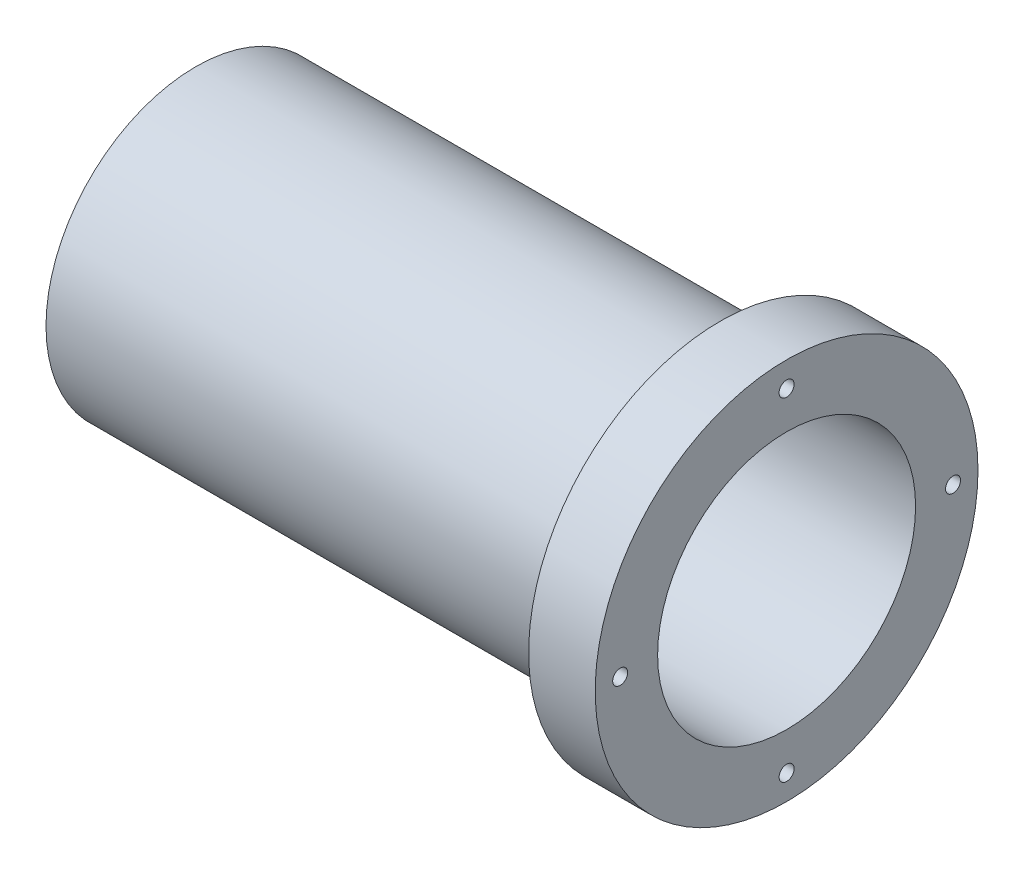
ISO-10303-21;
HEADER;
FILE_DESCRIPTION(('STEP AP214'),'2;1');
FILE_NAME('part.step','',(''),(''),'','','');
FILE_SCHEMA(('AUTOMOTIVE_DESIGN { 1 0 10303 214 1 1 1 1 }'));
ENDSEC;
DATA;
#1=APPLICATION_CONTEXT('core data for automotive mechanical design processes');
#2=APPLICATION_PROTOCOL_DEFINITION('international standard','automotive_design',2000,#1);
#3=PRODUCT_CONTEXT('',#1,'mechanical');
#4=PRODUCT('Part','Part','',(#3));
#5=PRODUCT_RELATED_PRODUCT_CATEGORY('part','',(#4));
#6=PRODUCT_DEFINITION_FORMATION('','',#4);
#7=PRODUCT_DEFINITION_CONTEXT('part definition',#1,'design');
#8=PRODUCT_DEFINITION('design','',#6,#7);
#9=PRODUCT_DEFINITION_SHAPE('','',#8);
#10=(LENGTH_UNIT() NAMED_UNIT(*) SI_UNIT(.MILLI.,.METRE.));
#11=(NAMED_UNIT(*) PLANE_ANGLE_UNIT() SI_UNIT($,.RADIAN.));
#12=(NAMED_UNIT(*) SI_UNIT($,.STERADIAN.) SOLID_ANGLE_UNIT());
#13=UNCERTAINTY_MEASURE_WITH_UNIT(LENGTH_MEASURE(1.E-05),#10,'distance_accuracy_value','');
#14=(GEOMETRIC_REPRESENTATION_CONTEXT(3) GLOBAL_UNCERTAINTY_ASSIGNED_CONTEXT((#13)) GLOBAL_UNIT_ASSIGNED_CONTEXT((#10,
#11,#12)) REPRESENTATION_CONTEXT('',''));
#15=CARTESIAN_POINT('',(0.,0.,0.));
#16=DIRECTION('',(0.,0.,1.));
#17=DIRECTION('',(1.,0.,0.));
#18=AXIS2_PLACEMENT_3D('',#15,#16,#17);
#19=CARTESIAN_POINT('',(121.,0.,0.));
#20=DIRECTION('',(-1.,0.,0.));
#21=DIRECTION('',(0.,0.,1.));
#22=AXIS2_PLACEMENT_3D('',#19,#20,#21);
#23=CYLINDRICAL_SURFACE('',#22,36.);
#24=CARTESIAN_POINT('',(121.,0.,0.));
#25=DIRECTION('',(1.,0.,0.));
#26=DIRECTION('',(0.,0.,-1.));
#27=AXIS2_PLACEMENT_3D('',#24,#25,#26);
#28=CIRCLE('',#27,36.);
#29=CARTESIAN_POINT('',(121.,0.,-36.));
#30=VERTEX_POINT('',#29);
#31=EDGE_CURVE('E10',#30,#30,#28,.T.);
#32=ORIENTED_EDGE('',*,*,#31,.F.);
#33=EDGE_LOOP('',(#32));
#34=FACE_BOUND('',#33,.T.);
#35=CARTESIAN_POINT('',(-5.,0.,0.));
#36=DIRECTION('',(-1.,0.,0.));
#37=DIRECTION('',(0.,0.,1.));
#38=AXIS2_PLACEMENT_3D('',#35,#36,#37);
#39=CIRCLE('',#38,36.);
#40=CARTESIAN_POINT('',(-5.,0.,36.));
#41=VERTEX_POINT('',#40);
#42=EDGE_CURVE('E73',#41,#41,#39,.T.);
#43=ORIENTED_EDGE('',*,*,#42,.F.);
#44=EDGE_LOOP('',(#43));
#45=FACE_BOUND('',#44,.T.);
#46=ADVANCED_FACE('F37',(#34,#45),#23,.T.);
#47=CARTESIAN_POINT('',(121.,0.,0.));
#48=DIRECTION('',(-1.,0.,0.));
#49=DIRECTION('',(0.,0.,1.));
#50=AXIS2_PLACEMENT_3D('',#47,#48,#49);
#51=CYLINDRICAL_SURFACE('',#50,31.);
#52=CARTESIAN_POINT('',(0.,0.,0.));
#53=DIRECTION('',(1.,0.,0.));
#54=DIRECTION('',(0.,0.,-1.));
#55=AXIS2_PLACEMENT_3D('',#52,#53,#54);
#56=CIRCLE('',#55,31.);
#57=CARTESIAN_POINT('',(0.,0.,-31.));
#58=VERTEX_POINT('',#57);
#59=EDGE_CURVE('E44',#58,#58,#56,.T.);
#60=ORIENTED_EDGE('',*,*,#59,.F.);
#61=EDGE_LOOP('',(#60));
#62=FACE_BOUND('',#61,.T.);
#63=CARTESIAN_POINT('',(137.,0.,0.));
#64=DIRECTION('',(1.,0.,0.));
#65=DIRECTION('',(0.,0.,-1.));
#66=AXIS2_PLACEMENT_3D('',#63,#64,#65);
#67=CIRCLE('',#66,31.);
#68=CARTESIAN_POINT('',(137.,0.,-31.));
#69=VERTEX_POINT('',#68);
#70=EDGE_CURVE('E85',#69,#69,#67,.T.);
#71=ORIENTED_EDGE('',*,*,#70,.T.);
#72=EDGE_LOOP('',(#71));
#73=FACE_BOUND('',#72,.T.);
#74=ADVANCED_FACE('F106',(#62,#73),#51,.F.);
#75=CARTESIAN_POINT('',(137.,0.,0.));
#76=DIRECTION('',(1.,0.,0.));
#77=DIRECTION('',(0.,0.,-1.));
#78=AXIS2_PLACEMENT_3D('',#75,#76,#77);
#79=PLANE('',#78);
#80=CARTESIAN_POINT('',(137.,40.,0.));
#81=DIRECTION('',(1.,0.,0.));
#82=DIRECTION('',(0.,0.,-1.));
#83=AXIS2_PLACEMENT_3D('',#80,#81,#82);
#84=CIRCLE('',#83,1.80000000000249);
#85=CARTESIAN_POINT('',(137.,40.,-1.80000000000249));
#86=VERTEX_POINT('',#85);
#87=EDGE_CURVE('E57',#86,#86,#84,.T.);
#88=ORIENTED_EDGE('',*,*,#87,.F.);
#89=EDGE_LOOP('',(#88));
#90=FACE_BOUND('',#89,.T.);
#91=CARTESIAN_POINT('',(137.,1.15690195501756E-12,-40.0000000000012));
#92=DIRECTION('',(1.,0.,0.));
#93=DIRECTION('',(0.,0.,-1.));
#94=AXIS2_PLACEMENT_3D('',#91,#92,#93);
#95=CIRCLE('',#94,1.80000000000249);
#96=CARTESIAN_POINT('',(137.,1.15690195501756E-12,-41.8000000000036));
#97=VERTEX_POINT('',#96);
#98=EDGE_CURVE('E269',#97,#97,#95,.T.);
#99=ORIENTED_EDGE('',*,*,#98,.F.);
#100=EDGE_LOOP('',(#99));
#101=FACE_BOUND('',#100,.T.);
#102=CARTESIAN_POINT('',(137.,-40.,-2.31489411623018E-12));
#103=DIRECTION('',(1.,0.,0.));
#104=DIRECTION('',(0.,0.,-1.));
#105=AXIS2_PLACEMENT_3D('',#102,#103,#104);
#106=CIRCLE('',#105,1.80000000000249);
#107=CARTESIAN_POINT('',(137.,-40.,-1.8000000000048));
#108=VERTEX_POINT('',#107);
#109=EDGE_CURVE('E272',#108,#108,#106,.T.);
#110=ORIENTED_EDGE('',*,*,#109,.F.);
#111=EDGE_LOOP('',(#110));
#112=FACE_BOUND('',#111,.T.);
#113=CARTESIAN_POINT('',(137.,-1.16180054221415E-12,39.9999999999988));
#114=DIRECTION('',(1.,0.,0.));
#115=DIRECTION('',(0.,0.,-1.));
#116=AXIS2_PLACEMENT_3D('',#113,#114,#115);
#117=CIRCLE('',#116,1.80000000000249);
#118=CARTESIAN_POINT('',(137.,-1.16180054221415E-12,38.1999999999964));
#119=VERTEX_POINT('',#118);
#120=EDGE_CURVE('E276',#119,#119,#117,.T.);
#121=ORIENTED_EDGE('',*,*,#120,.F.);
#122=EDGE_LOOP('',(#121));
#123=FACE_BOUND('',#122,.T.);
#124=CARTESIAN_POINT('',(137.,0.,0.));
#125=DIRECTION('',(1.,0.,0.));
#126=DIRECTION('',(0.,0.,-1.));
#127=AXIS2_PLACEMENT_3D('',#124,#125,#126);
#128=CIRCLE('',#127,46.);
#129=CARTESIAN_POINT('',(137.,0.,-46.));
#130=VERTEX_POINT('',#129);
#131=EDGE_CURVE('E49',#130,#130,#128,.T.);
#132=ORIENTED_EDGE('',*,*,#131,.T.);
#133=EDGE_LOOP('',(#132));
#134=FACE_BOUND('',#133,.T.);
#135=ORIENTED_EDGE('',*,*,#70,.F.);
#136=EDGE_LOOP('',(#135));
#137=FACE_BOUND('',#136,.T.);
#138=ADVANCED_FACE('F97',(#90,#101,#112,#123,#134,#137),#79,.T.);
#139=CARTESIAN_POINT('',(121.,0.,0.));
#140=DIRECTION('',(1.,0.,0.));
#141=DIRECTION('',(0.,0.,-1.));
#142=AXIS2_PLACEMENT_3D('',#139,#140,#141);
#143=PLANE('',#142);
#144=CARTESIAN_POINT('',(121.,40.,0.));
#145=DIRECTION('',(1.,0.,0.));
#146=DIRECTION('',(0.,0.,-1.));
#147=AXIS2_PLACEMENT_3D('',#144,#145,#146);
#148=CIRCLE('',#147,1.80000000000249);
#149=CARTESIAN_POINT('',(121.,40.,-1.80000000000249));
#150=VERTEX_POINT('',#149);
#151=EDGE_CURVE('E40',#150,#150,#148,.T.);
#152=ORIENTED_EDGE('',*,*,#151,.T.);
#153=EDGE_LOOP('',(#152));
#154=FACE_BOUND('',#153,.T.);
#155=CARTESIAN_POINT('',(121.,1.15690195501756E-12,-40.0000000000012));
#156=DIRECTION('',(1.,0.,0.));
#157=DIRECTION('',(0.,0.,-1.));
#158=AXIS2_PLACEMENT_3D('',#155,#156,#157);
#159=CIRCLE('',#158,1.80000000000249);
#160=CARTESIAN_POINT('',(121.,1.15690195501756E-12,-41.8000000000036));
#161=VERTEX_POINT('',#160);
#162=EDGE_CURVE('E59',#161,#161,#159,.T.);
#163=ORIENTED_EDGE('',*,*,#162,.T.);
#164=EDGE_LOOP('',(#163));
#165=FACE_BOUND('',#164,.T.);
#166=CARTESIAN_POINT('',(121.,-40.,-2.31489411623018E-12));
#167=DIRECTION('',(1.,0.,0.));
#168=DIRECTION('',(0.,0.,-1.));
#169=AXIS2_PLACEMENT_3D('',#166,#167,#168);
#170=CIRCLE('',#169,1.80000000000249);
#171=CARTESIAN_POINT('',(121.,-40.,-1.8000000000048));
#172=VERTEX_POINT('',#171);
#173=EDGE_CURVE('E56',#172,#172,#170,.T.);
#174=ORIENTED_EDGE('',*,*,#173,.T.);
#175=EDGE_LOOP('',(#174));
#176=FACE_BOUND('',#175,.T.);
#177=CARTESIAN_POINT('',(121.,-1.16180054221415E-12,39.9999999999988));
#178=DIRECTION('',(1.,0.,0.));
#179=DIRECTION('',(0.,0.,-1.));
#180=AXIS2_PLACEMENT_3D('',#177,#178,#179);
#181=CIRCLE('',#180,1.80000000000249);
#182=CARTESIAN_POINT('',(121.,-1.16180054221415E-12,38.1999999999964));
#183=VERTEX_POINT('',#182);
#184=EDGE_CURVE('E53',#183,#183,#181,.T.);
#185=ORIENTED_EDGE('',*,*,#184,.T.);
#186=EDGE_LOOP('',(#185));
#187=FACE_BOUND('',#186,.T.);
#188=ORIENTED_EDGE('',*,*,#31,.T.);
#189=EDGE_LOOP('',(#188));
#190=FACE_BOUND('',#189,.T.);
#191=CARTESIAN_POINT('',(121.,0.,0.));
#192=DIRECTION('',(1.,0.,0.));
#193=DIRECTION('',(0.,0.,-1.));
#194=AXIS2_PLACEMENT_3D('',#191,#192,#193);
#195=CIRCLE('',#194,46.);
#196=CARTESIAN_POINT('',(121.,0.,-46.));
#197=VERTEX_POINT('',#196);
#198=EDGE_CURVE('E88',#197,#197,#195,.T.);
#199=ORIENTED_EDGE('',*,*,#198,.F.);
#200=EDGE_LOOP('',(#199));
#201=FACE_BOUND('',#200,.T.);
#202=ADVANCED_FACE('F95',(#154,#165,#176,#187,#190,#201),#143,.F.);
#203=CARTESIAN_POINT('',(137.,0.,0.));
#204=DIRECTION('',(-1.,0.,0.));
#205=DIRECTION('',(0.,0.,1.));
#206=AXIS2_PLACEMENT_3D('',#203,#204,#205);
#207=CYLINDRICAL_SURFACE('',#206,46.);
#208=ORIENTED_EDGE('',*,*,#131,.F.);
#209=EDGE_LOOP('',(#208));
#210=FACE_BOUND('',#209,.T.);
#211=ORIENTED_EDGE('',*,*,#198,.T.);
#212=EDGE_LOOP('',(#211));
#213=FACE_BOUND('',#212,.T.);
#214=ADVANCED_FACE('F93',(#210,#213),#207,.T.);
#215=CARTESIAN_POINT('',(0.,0.,0.));
#216=DIRECTION('',(-1.,0.,0.));
#217=DIRECTION('',(0.,0.,1.));
#218=AXIS2_PLACEMENT_3D('',#215,#216,#217);
#219=PLANE('',#218);
#220=CARTESIAN_POINT('',(0.,0.,0.));
#221=DIRECTION('',(-1.,0.,0.));
#222=DIRECTION('',(0.,0.,1.));
#223=AXIS2_PLACEMENT_3D('',#220,#221,#222);
#224=CIRCLE('',#223,28.5);
#225=CARTESIAN_POINT('',(0.,0.,28.5));
#226=VERTEX_POINT('',#225);
#227=EDGE_CURVE('E82',#226,#226,#224,.T.);
#228=ORIENTED_EDGE('',*,*,#227,.T.);
#229=EDGE_LOOP('',(#228));
#230=FACE_BOUND('',#229,.T.);
#231=ORIENTED_EDGE('',*,*,#59,.T.);
#232=EDGE_LOOP('',(#231));
#233=FACE_BOUND('',#232,.T.);
#234=ADVANCED_FACE('F103',(#230,#233),#219,.F.);
#235=CARTESIAN_POINT('',(-2.,0.,0.));
#236=DIRECTION('',(1.,0.,0.));
#237=DIRECTION('',(0.,0.,-1.));
#238=AXIS2_PLACEMENT_3D('',#235,#236,#237);
#239=CYLINDRICAL_SURFACE('',#238,28.5);
#240=CARTESIAN_POINT('',(-2.,0.,0.));
#241=DIRECTION('',(-1.,0.,0.));
#242=DIRECTION('',(0.,0.,1.));
#243=AXIS2_PLACEMENT_3D('',#240,#241,#242);
#244=CIRCLE('',#243,28.5);
#245=CARTESIAN_POINT('',(-2.,0.,28.5));
#246=VERTEX_POINT('',#245);
#247=EDGE_CURVE('E79',#246,#246,#244,.T.);
#248=ORIENTED_EDGE('',*,*,#247,.T.);
#249=EDGE_LOOP('',(#248));
#250=FACE_BOUND('',#249,.T.);
#251=ORIENTED_EDGE('',*,*,#227,.F.);
#252=EDGE_LOOP('',(#251));
#253=FACE_BOUND('',#252,.T.);
#254=ADVANCED_FACE('F140',(#250,#253),#239,.F.);
#255=CARTESIAN_POINT('',(-2.,0.,0.));
#256=DIRECTION('',(-1.,0.,0.));
#257=DIRECTION('',(0.,0.,1.));
#258=AXIS2_PLACEMENT_3D('',#255,#256,#257);
#259=PLANE('',#258);
#260=CARTESIAN_POINT('',(-2.,0.,0.));
#261=DIRECTION('',(-1.,0.,0.));
#262=DIRECTION('',(0.,0.,1.));
#263=AXIS2_PLACEMENT_3D('',#260,#261,#262);
#264=CIRCLE('',#263,17.);
#265=CARTESIAN_POINT('',(-2.,0.,17.));
#266=VERTEX_POINT('',#265);
#267=EDGE_CURVE('E64',#266,#266,#264,.T.);
#268=ORIENTED_EDGE('',*,*,#267,.T.);
#269=EDGE_LOOP('',(#268));
#270=FACE_BOUND('',#269,.T.);
#271=ORIENTED_EDGE('',*,*,#247,.F.);
#272=EDGE_LOOP('',(#271));
#273=FACE_BOUND('',#272,.T.);
#274=ADVANCED_FACE('F122',(#270,#273),#259,.F.);
#275=CARTESIAN_POINT('',(-5.,0.,0.));
#276=DIRECTION('',(-1.,0.,0.));
#277=DIRECTION('',(0.,0.,1.));
#278=AXIS2_PLACEMENT_3D('',#275,#276,#277);
#279=PLANE('',#278);
#280=ORIENTED_EDGE('',*,*,#42,.T.);
#281=EDGE_LOOP('',(#280));
#282=FACE_BOUND('',#281,.T.);
#283=CARTESIAN_POINT('',(-5.,0.,0.));
#284=DIRECTION('',(-1.,0.,0.));
#285=DIRECTION('',(0.,0.,1.));
#286=AXIS2_PLACEMENT_3D('',#283,#284,#285);
#287=CIRCLE('',#286,17.);
#288=CARTESIAN_POINT('',(-5.,0.,17.));
#289=VERTEX_POINT('',#288);
#290=EDGE_CURVE('E68',#289,#289,#287,.T.);
#291=ORIENTED_EDGE('',*,*,#290,.F.);
#292=EDGE_LOOP('',(#291));
#293=FACE_BOUND('',#292,.T.);
#294=ADVANCED_FACE('F118',(#282,#293),#279,.T.);
#295=CARTESIAN_POINT('',(-5.,0.,0.));
#296=DIRECTION('',(1.,0.,0.));
#297=DIRECTION('',(0.,0.,-1.));
#298=AXIS2_PLACEMENT_3D('',#295,#296,#297);
#299=CYLINDRICAL_SURFACE('',#298,17.);
#300=ORIENTED_EDGE('',*,*,#290,.T.);
#301=EDGE_LOOP('',(#300));
#302=FACE_BOUND('',#301,.T.);
#303=ORIENTED_EDGE('',*,*,#267,.F.);
#304=EDGE_LOOP('',(#303));
#305=FACE_BOUND('',#304,.T.);
#306=ADVANCED_FACE('F121',(#302,#305),#299,.F.);
#307=CARTESIAN_POINT('',(117.,-1.16180054221415E-12,39.9999999999988));
#308=DIRECTION('',(1.,0.,0.));
#309=DIRECTION('',(0.,0.,-1.));
#310=AXIS2_PLACEMENT_3D('',#307,#308,#309);
#311=CYLINDRICAL_SURFACE('',#310,1.80000000000249);
#312=ORIENTED_EDGE('',*,*,#120,.T.);
#313=EDGE_LOOP('',(#312));
#314=FACE_BOUND('',#313,.T.);
#315=ORIENTED_EDGE('',*,*,#184,.F.);
#316=EDGE_LOOP('',(#315));
#317=FACE_BOUND('',#316,.T.);
#318=ADVANCED_FACE('F128',(#314,#317),#311,.F.);
#319=CARTESIAN_POINT('',(117.,-40.,-2.31489411623018E-12));
#320=DIRECTION('',(1.,0.,0.));
#321=DIRECTION('',(0.,0.,-1.));
#322=AXIS2_PLACEMENT_3D('',#319,#320,#321);
#323=CYLINDRICAL_SURFACE('',#322,1.80000000000249);
#324=ORIENTED_EDGE('',*,*,#109,.T.);
#325=EDGE_LOOP('',(#324));
#326=FACE_BOUND('',#325,.T.);
#327=ORIENTED_EDGE('',*,*,#173,.F.);
#328=EDGE_LOOP('',(#327));
#329=FACE_BOUND('',#328,.T.);
#330=ADVANCED_FACE('F133',(#326,#329),#323,.F.);
#331=CARTESIAN_POINT('',(117.,1.15690195501756E-12,-40.0000000000012));
#332=DIRECTION('',(1.,0.,0.));
#333=DIRECTION('',(0.,0.,-1.));
#334=AXIS2_PLACEMENT_3D('',#331,#332,#333);
#335=CYLINDRICAL_SURFACE('',#334,1.80000000000249);
#336=ORIENTED_EDGE('',*,*,#98,.T.);
#337=EDGE_LOOP('',(#336));
#338=FACE_BOUND('',#337,.T.);
#339=ORIENTED_EDGE('',*,*,#162,.F.);
#340=EDGE_LOOP('',(#339));
#341=FACE_BOUND('',#340,.T.);
#342=ADVANCED_FACE('F203',(#338,#341),#335,.F.);
#343=CARTESIAN_POINT('',(117.,40.,0.));
#344=DIRECTION('',(1.,0.,0.));
#345=DIRECTION('',(0.,0.,-1.));
#346=AXIS2_PLACEMENT_3D('',#343,#344,#345);
#347=CYLINDRICAL_SURFACE('',#346,1.80000000000249);
#348=ORIENTED_EDGE('',*,*,#87,.T.);
#349=EDGE_LOOP('',(#348));
#350=FACE_BOUND('',#349,.T.);
#351=ORIENTED_EDGE('',*,*,#151,.F.);
#352=EDGE_LOOP('',(#351));
#353=FACE_BOUND('',#352,.T.);
#354=ADVANCED_FACE('F213',(#350,#353),#347,.F.);
#355=CLOSED_SHELL('',(#46,#74,#138,#202,#214,#234,#254,#274,#294,#306,#318,#330,#342,#354));
#356=MANIFOLD_SOLID_BREP('B2',#355);
#357=ADVANCED_BREP_SHAPE_REPRESENTATION('',(#18,#356),#14);
#358=SHAPE_DEFINITION_REPRESENTATION(#9,#357);
ENDSEC;
END-ISO-10303-21;
